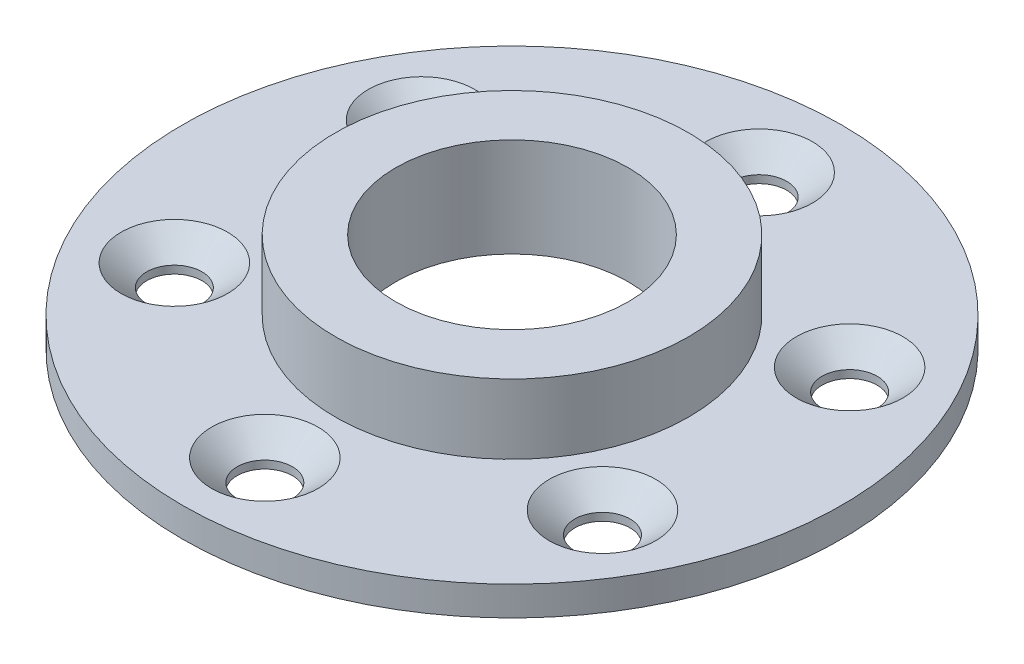
ISO-10303-21;
HEADER;
FILE_DESCRIPTION(('STEP AP214'),'2;1');
FILE_NAME('part.step','',(''),(''),'','','');
FILE_SCHEMA(('AUTOMOTIVE_DESIGN { 1 0 10303 214 1 1 1 1 }'));
ENDSEC;
DATA;
#1=APPLICATION_CONTEXT('core data for automotive mechanical design processes');
#2=APPLICATION_PROTOCOL_DEFINITION('international standard','automotive_design',2000,#1);
#3=PRODUCT_CONTEXT('',#1,'mechanical');
#4=PRODUCT('Part','Part','',(#3));
#5=PRODUCT_RELATED_PRODUCT_CATEGORY('part','',(#4));
#6=PRODUCT_DEFINITION_FORMATION('','',#4);
#7=PRODUCT_DEFINITION_CONTEXT('part definition',#1,'design');
#8=PRODUCT_DEFINITION('design','',#6,#7);
#9=PRODUCT_DEFINITION_SHAPE('','',#8);
#10=(LENGTH_UNIT() NAMED_UNIT(*) SI_UNIT(.MILLI.,.METRE.));
#11=(NAMED_UNIT(*) PLANE_ANGLE_UNIT() SI_UNIT($,.RADIAN.));
#12=(NAMED_UNIT(*) SI_UNIT($,.STERADIAN.) SOLID_ANGLE_UNIT());
#13=UNCERTAINTY_MEASURE_WITH_UNIT(LENGTH_MEASURE(1.E-05),#10,'distance_accuracy_value','');
#14=(GEOMETRIC_REPRESENTATION_CONTEXT(3) GLOBAL_UNCERTAINTY_ASSIGNED_CONTEXT((#13)) GLOBAL_UNIT_ASSIGNED_CONTEXT((#10,
#11,#12)) REPRESENTATION_CONTEXT('',''));
#15=CARTESIAN_POINT('',(0.,0.,0.));
#16=DIRECTION('',(0.,0.,1.));
#17=DIRECTION('',(1.,0.,0.));
#18=AXIS2_PLACEMENT_3D('',#15,#16,#17);
#19=CARTESIAN_POINT('',(0.,8.,0.));
#20=DIRECTION('',(0.,-1.,0.));
#21=DIRECTION('',(0.,0.,-1.));
#22=AXIS2_PLACEMENT_3D('',#19,#20,#21);
#23=CYLINDRICAL_SURFACE('',#22,90.);
#24=CARTESIAN_POINT('',(0.,8.,0.));
#25=DIRECTION('',(0.,1.,0.));
#26=DIRECTION('',(0.,0.,1.));
#27=AXIS2_PLACEMENT_3D('',#24,#25,#26);
#28=CIRCLE('',#27,90.);
#29=CARTESIAN_POINT('',(0.,8.,90.));
#30=VERTEX_POINT('',#29);
#31=EDGE_CURVE('E12',#30,#30,#28,.T.);
#32=ORIENTED_EDGE('',*,*,#31,.F.);
#33=EDGE_LOOP('',(#32));
#34=FACE_BOUND('',#33,.T.);
#35=CARTESIAN_POINT('',(0.,0.,0.));
#36=DIRECTION('',(0.,1.,0.));
#37=DIRECTION('',(0.,0.,1.));
#38=AXIS2_PLACEMENT_3D('',#35,#36,#37);
#39=CIRCLE('',#38,90.);
#40=CARTESIAN_POINT('',(0.,0.,90.));
#41=VERTEX_POINT('',#40);
#42=EDGE_CURVE('E65',#41,#41,#39,.T.);
#43=ORIENTED_EDGE('',*,*,#42,.T.);
#44=EDGE_LOOP('',(#43));
#45=FACE_BOUND('',#44,.T.);
#46=ADVANCED_FACE('F62',(#34,#45),#23,.T.);
#47=CARTESIAN_POINT('',(0.,8.,0.));
#48=DIRECTION('',(0.,1.,0.));
#49=DIRECTION('',(0.,0.,1.));
#50=AXIS2_PLACEMENT_3D('',#47,#48,#49);
#51=PLANE('',#50);
#52=CARTESIAN_POINT('',(58.4567147554492,8.,-33.7500000000007));
#53=DIRECTION('',(0.,1.,0.));
#54=DIRECTION('',(0.,0.,1.));
#55=AXIS2_PLACEMENT_3D('',#52,#53,#54);
#56=CIRCLE('',#55,14.5415);
#57=CARTESIAN_POINT('',(58.4567147554492,8.,-19.2085000000007));
#58=VERTEX_POINT('',#57);
#59=EDGE_CURVE('E159',#58,#58,#56,.T.);
#60=ORIENTED_EDGE('',*,*,#59,.F.);
#61=EDGE_LOOP('',(#60));
#62=FACE_BOUND('',#61,.T.);
#63=CARTESIAN_POINT('',(58.4567147554499,8.,33.7499999999995));
#64=DIRECTION('',(0.,1.,0.));
#65=DIRECTION('',(0.,0.,1.));
#66=AXIS2_PLACEMENT_3D('',#63,#64,#65);
#67=CIRCLE('',#66,14.5415);
#68=CARTESIAN_POINT('',(58.4567147554499,8.,48.2914999999995));
#69=VERTEX_POINT('',#68);
#70=EDGE_CURVE('E147',#69,#69,#67,.T.);
#71=ORIENTED_EDGE('',*,*,#70,.F.);
#72=EDGE_LOOP('',(#71));
#73=FACE_BOUND('',#72,.T.);
#74=CARTESIAN_POINT('',(0.,8.,67.5));
#75=DIRECTION('',(0.,1.,0.));
#76=DIRECTION('',(0.,0.,1.));
#77=AXIS2_PLACEMENT_3D('',#74,#75,#76);
#78=CIRCLE('',#77,14.5415);
#79=CARTESIAN_POINT('',(0.,8.,82.0415));
#80=VERTEX_POINT('',#79);
#81=EDGE_CURVE('E135',#80,#80,#78,.T.);
#82=ORIENTED_EDGE('',*,*,#81,.F.);
#83=EDGE_LOOP('',(#82));
#84=FACE_BOUND('',#83,.T.);
#85=CARTESIAN_POINT('',(-58.4567147554495,8.,33.7500000000003));
#86=DIRECTION('',(0.,1.,0.));
#87=DIRECTION('',(0.,0.,1.));
#88=AXIS2_PLACEMENT_3D('',#85,#86,#87);
#89=CIRCLE('',#88,14.5415);
#90=CARTESIAN_POINT('',(-58.4567147554495,8.,48.2915000000003));
#91=VERTEX_POINT('',#90);
#92=EDGE_CURVE('E123',#91,#91,#89,.T.);
#93=ORIENTED_EDGE('',*,*,#92,.F.);
#94=EDGE_LOOP('',(#93));
#95=FACE_BOUND('',#94,.T.);
#96=CARTESIAN_POINT('',(-58.4567147554497,8.,-33.7499999999999));
#97=DIRECTION('',(0.,1.,0.));
#98=DIRECTION('',(0.,0.,1.));
#99=AXIS2_PLACEMENT_3D('',#96,#97,#98);
#100=CIRCLE('',#99,14.5415);
#101=CARTESIAN_POINT('',(-58.4567147554497,8.,-19.2084999999999));
#102=VERTEX_POINT('',#101);
#103=EDGE_CURVE('E111',#102,#102,#100,.T.);
#104=ORIENTED_EDGE('',*,*,#103,.F.);
#105=EDGE_LOOP('',(#104));
#106=FACE_BOUND('',#105,.T.);
#107=CARTESIAN_POINT('',(0.,8.,-67.5));
#108=DIRECTION('',(0.,1.,0.));
#109=DIRECTION('',(0.,0.,1.));
#110=AXIS2_PLACEMENT_3D('',#107,#108,#109);
#111=CIRCLE('',#110,14.5415);
#112=CARTESIAN_POINT('',(0.,8.,-52.9585));
#113=VERTEX_POINT('',#112);
#114=EDGE_CURVE('E99',#113,#113,#111,.T.);
#115=ORIENTED_EDGE('',*,*,#114,.F.);
#116=EDGE_LOOP('',(#115));
#117=FACE_BOUND('',#116,.T.);
#118=CARTESIAN_POINT('',(0.,8.,0.));
#119=DIRECTION('',(0.,1.,0.));
#120=DIRECTION('',(1.,0.,0.));
#121=AXIS2_PLACEMENT_3D('',#118,#119,#120);
#122=CIRCLE('',#121,48.25);
#123=CARTESIAN_POINT('',(48.25,8.,0.));
#124=VERTEX_POINT('',#123);
#125=EDGE_CURVE('E77',#124,#124,#122,.T.);
#126=ORIENTED_EDGE('',*,*,#125,.F.);
#127=EDGE_LOOP('',(#126));
#128=FACE_BOUND('',#127,.T.);
#129=ORIENTED_EDGE('',*,*,#31,.T.);
#130=EDGE_LOOP('',(#129));
#131=FACE_BOUND('',#130,.T.);
#132=ADVANCED_FACE('F190',(#62,#73,#84,#95,#106,#117,#128,#131),#51,.T.);
#133=CARTESIAN_POINT('',(0.,0.,0.));
#134=DIRECTION('',(0.,1.,0.));
#135=DIRECTION('',(0.,0.,1.));
#136=AXIS2_PLACEMENT_3D('',#133,#134,#135);
#137=PLANE('',#136);
#138=CARTESIAN_POINT('',(0.,0.,0.));
#139=DIRECTION('',(0.,1.,0.));
#140=DIRECTION('',(0.,0.,1.));
#141=AXIS2_PLACEMENT_3D('',#138,#139,#140);
#142=CIRCLE('',#141,31.75);
#143=CARTESIAN_POINT('',(0.,0.,31.75));
#144=VERTEX_POINT('',#143);
#145=EDGE_CURVE('E163',#144,#144,#142,.T.);
#146=ORIENTED_EDGE('',*,*,#145,.T.);
#147=EDGE_LOOP('',(#146));
#148=FACE_BOUND('',#147,.T.);
#149=CARTESIAN_POINT('',(58.4567147554492,0.,-33.7500000000007));
#150=DIRECTION('',(0.,1.,0.));
#151=DIRECTION('',(0.,0.,1.));
#152=AXIS2_PLACEMENT_3D('',#149,#150,#151);
#153=CIRCLE('',#152,7.53999);
#154=CARTESIAN_POINT('',(58.4567147554492,0.,-26.2100100000007));
#155=VERTEX_POINT('',#154);
#156=EDGE_CURVE('E151',#155,#155,#153,.T.);
#157=ORIENTED_EDGE('',*,*,#156,.T.);
#158=EDGE_LOOP('',(#157));
#159=FACE_BOUND('',#158,.T.);
#160=CARTESIAN_POINT('',(58.4567147554499,0.,33.7499999999995));
#161=DIRECTION('',(0.,1.,0.));
#162=DIRECTION('',(0.,0.,1.));
#163=AXIS2_PLACEMENT_3D('',#160,#161,#162);
#164=CIRCLE('',#163,7.53999);
#165=CARTESIAN_POINT('',(58.4567147554499,0.,41.2899899999995));
#166=VERTEX_POINT('',#165);
#167=EDGE_CURVE('E139',#166,#166,#164,.T.);
#168=ORIENTED_EDGE('',*,*,#167,.T.);
#169=EDGE_LOOP('',(#168));
#170=FACE_BOUND('',#169,.T.);
#171=CARTESIAN_POINT('',(0.,0.,67.5));
#172=DIRECTION('',(0.,1.,0.));
#173=DIRECTION('',(0.,0.,1.));
#174=AXIS2_PLACEMENT_3D('',#171,#172,#173);
#175=CIRCLE('',#174,7.53999);
#176=CARTESIAN_POINT('',(0.,0.,75.03999));
#177=VERTEX_POINT('',#176);
#178=EDGE_CURVE('E127',#177,#177,#175,.T.);
#179=ORIENTED_EDGE('',*,*,#178,.T.);
#180=EDGE_LOOP('',(#179));
#181=FACE_BOUND('',#180,.T.);
#182=CARTESIAN_POINT('',(-58.4567147554495,0.,33.7500000000003));
#183=DIRECTION('',(0.,1.,0.));
#184=DIRECTION('',(0.,0.,1.));
#185=AXIS2_PLACEMENT_3D('',#182,#183,#184);
#186=CIRCLE('',#185,7.53999);
#187=CARTESIAN_POINT('',(-58.4567147554495,0.,41.2899900000003));
#188=VERTEX_POINT('',#187);
#189=EDGE_CURVE('E115',#188,#188,#186,.T.);
#190=ORIENTED_EDGE('',*,*,#189,.T.);
#191=EDGE_LOOP('',(#190));
#192=FACE_BOUND('',#191,.T.);
#193=CARTESIAN_POINT('',(-58.4567147554497,0.,-33.7499999999999));
#194=DIRECTION('',(0.,1.,0.));
#195=DIRECTION('',(0.,0.,1.));
#196=AXIS2_PLACEMENT_3D('',#193,#194,#195);
#197=CIRCLE('',#196,7.53999);
#198=CARTESIAN_POINT('',(-58.4567147554497,0.,-26.2100099999999));
#199=VERTEX_POINT('',#198);
#200=EDGE_CURVE('E103',#199,#199,#197,.T.);
#201=ORIENTED_EDGE('',*,*,#200,.T.);
#202=EDGE_LOOP('',(#201));
#203=FACE_BOUND('',#202,.T.);
#204=CARTESIAN_POINT('',(0.,0.,-67.5));
#205=DIRECTION('',(0.,1.,0.));
#206=DIRECTION('',(0.,0.,1.));
#207=AXIS2_PLACEMENT_3D('',#204,#205,#206);
#208=CIRCLE('',#207,7.53999);
#209=CARTESIAN_POINT('',(0.,0.,-59.96001));
#210=VERTEX_POINT('',#209);
#211=EDGE_CURVE('E91',#210,#210,#208,.T.);
#212=ORIENTED_EDGE('',*,*,#211,.T.);
#213=EDGE_LOOP('',(#212));
#214=FACE_BOUND('',#213,.T.);
#215=ORIENTED_EDGE('',*,*,#42,.F.);
#216=EDGE_LOOP('',(#215));
#217=FACE_BOUND('',#216,.T.);
#218=ADVANCED_FACE('F168',(#148,#159,#170,#181,#192,#203,#214,#217),#137,.F.);
#219=CARTESIAN_POINT('',(0.,27.,0.));
#220=DIRECTION('',(0.,1.,0.));
#221=DIRECTION('',(0.,0.,1.));
#222=AXIS2_PLACEMENT_3D('',#219,#220,#221);
#223=PLANE('',#222);
#224=CARTESIAN_POINT('',(0.,27.,0.));
#225=DIRECTION('',(0.,1.,0.));
#226=DIRECTION('',(1.,0.,0.));
#227=AXIS2_PLACEMENT_3D('',#224,#225,#226);
#228=CIRCLE('',#227,48.25);
#229=CARTESIAN_POINT('',(48.25,27.,0.));
#230=VERTEX_POINT('',#229);
#231=EDGE_CURVE('E76',#230,#230,#228,.T.);
#232=ORIENTED_EDGE('',*,*,#231,.T.);
#233=EDGE_LOOP('',(#232));
#234=FACE_BOUND('',#233,.T.);
#235=CARTESIAN_POINT('',(0.,27.,0.));
#236=DIRECTION('',(0.,1.,0.));
#237=DIRECTION('',(1.,0.,0.));
#238=AXIS2_PLACEMENT_3D('',#235,#236,#237);
#239=CIRCLE('',#238,31.75);
#240=CARTESIAN_POINT('',(31.75,27.,0.));
#241=VERTEX_POINT('',#240);
#242=EDGE_CURVE('E82',#241,#241,#239,.T.);
#243=ORIENTED_EDGE('',*,*,#242,.F.);
#244=EDGE_LOOP('',(#243));
#245=FACE_BOUND('',#244,.T.);
#246=ADVANCED_FACE('F185',(#234,#245),#223,.T.);
#247=CARTESIAN_POINT('',(0.,27.,0.));
#248=DIRECTION('',(0.,-1.,0.));
#249=DIRECTION('',(0.,0.,-1.));
#250=AXIS2_PLACEMENT_3D('',#247,#248,#249);
#251=CYLINDRICAL_SURFACE('',#250,48.25);
#252=ORIENTED_EDGE('',*,*,#231,.F.);
#253=EDGE_LOOP('',(#252));
#254=FACE_BOUND('',#253,.T.);
#255=ORIENTED_EDGE('',*,*,#125,.T.);
#256=EDGE_LOOP('',(#255));
#257=FACE_BOUND('',#256,.T.);
#258=ADVANCED_FACE('F174',(#254,#257),#251,.T.);
#259=CARTESIAN_POINT('',(0.,27.,0.));
#260=DIRECTION('',(0.,-1.,0.));
#261=DIRECTION('',(0.,0.,-1.));
#262=AXIS2_PLACEMENT_3D('',#259,#260,#261);
#263=CYLINDRICAL_SURFACE('',#262,31.75);
#264=ORIENTED_EDGE('',*,*,#242,.T.);
#265=EDGE_LOOP('',(#264));
#266=FACE_BOUND('',#265,.T.);
#267=ORIENTED_EDGE('',*,*,#145,.F.);
#268=EDGE_LOOP('',(#267));
#269=FACE_BOUND('',#268,.T.);
#270=ADVANCED_FACE('F171',(#266,#269),#263,.F.);
#271=CARTESIAN_POINT('',(0.,8.,-67.5));
#272=DIRECTION('',(0.,1.,0.));
#273=DIRECTION('',(0.,0.,1.));
#274=AXIS2_PLACEMENT_3D('',#271,#272,#273);
#275=CYLINDRICAL_SURFACE('',#274,7.53999);
#276=ORIENTED_EDGE('',*,*,#211,.F.);
#277=EDGE_LOOP('',(#276));
#278=FACE_BOUND('',#277,.T.);
#279=CARTESIAN_POINT('',(0.,2.12503554131596,-67.5));
#280=DIRECTION('',(0.,1.,0.));
#281=DIRECTION('',(0.,0.,1.));
#282=AXIS2_PLACEMENT_3D('',#279,#280,#281);
#283=CIRCLE('',#282,7.53999);
#284=CARTESIAN_POINT('',(0.,2.12503554131596,-59.96001));
#285=VERTEX_POINT('',#284);
#286=EDGE_CURVE('E95',#285,#285,#283,.T.);
#287=ORIENTED_EDGE('',*,*,#286,.T.);
#288=EDGE_LOOP('',(#287));
#289=FACE_BOUND('',#288,.T.);
#290=ADVANCED_FACE('F173',(#278,#289),#275,.F.);
#291=CARTESIAN_POINT('',(0.,8.,-67.5));
#292=DIRECTION('',(0.,1.,0.));
#293=DIRECTION('',(0.,0.,1.));
#294=AXIS2_PLACEMENT_3D('',#291,#292,#293);
#295=CONICAL_SURFACE('',#294,14.5415,0.872664625997165);
#296=ORIENTED_EDGE('',*,*,#286,.F.);
#297=EDGE_LOOP('',(#296));
#298=FACE_BOUND('',#297,.T.);
#299=ORIENTED_EDGE('',*,*,#114,.T.);
#300=EDGE_LOOP('',(#299));
#301=FACE_BOUND('',#300,.T.);
#302=ADVANCED_FACE('F181',(#298,#301),#295,.F.);
#303=CARTESIAN_POINT('',(-58.4567147554497,8.,-33.7499999999999));
#304=DIRECTION('',(0.,1.,0.));
#305=DIRECTION('',(0.,0.,1.));
#306=AXIS2_PLACEMENT_3D('',#303,#304,#305);
#307=CYLINDRICAL_SURFACE('',#306,7.53999);
#308=ORIENTED_EDGE('',*,*,#200,.F.);
#309=EDGE_LOOP('',(#308));
#310=FACE_BOUND('',#309,.T.);
#311=CARTESIAN_POINT('',(-58.4567147554497,2.12503554131596,-33.7499999999999));
#312=DIRECTION('',(0.,1.,0.));
#313=DIRECTION('',(0.,0.,1.));
#314=AXIS2_PLACEMENT_3D('',#311,#312,#313);
#315=CIRCLE('',#314,7.53999);
#316=CARTESIAN_POINT('',(-58.4567147554497,2.12503554131596,-26.2100099999999));
#317=VERTEX_POINT('',#316);
#318=EDGE_CURVE('E107',#317,#317,#315,.T.);
#319=ORIENTED_EDGE('',*,*,#318,.T.);
#320=EDGE_LOOP('',(#319));
#321=FACE_BOUND('',#320,.T.);
#322=ADVANCED_FACE('F229',(#310,#321),#307,.F.);
#323=CARTESIAN_POINT('',(-58.4567147554497,8.,-33.7499999999999));
#324=DIRECTION('',(0.,1.,0.));
#325=DIRECTION('',(0.,0.,1.));
#326=AXIS2_PLACEMENT_3D('',#323,#324,#325);
#327=CONICAL_SURFACE('',#326,14.5415,0.872664625997165);
#328=ORIENTED_EDGE('',*,*,#318,.F.);
#329=EDGE_LOOP('',(#328));
#330=FACE_BOUND('',#329,.T.);
#331=ORIENTED_EDGE('',*,*,#103,.T.);
#332=EDGE_LOOP('',(#331));
#333=FACE_BOUND('',#332,.T.);
#334=ADVANCED_FACE('F246',(#330,#333),#327,.F.);
#335=CARTESIAN_POINT('',(-58.4567147554495,8.,33.7500000000003));
#336=DIRECTION('',(0.,1.,0.));
#337=DIRECTION('',(0.,0.,1.));
#338=AXIS2_PLACEMENT_3D('',#335,#336,#337);
#339=CYLINDRICAL_SURFACE('',#338,7.53999);
#340=ORIENTED_EDGE('',*,*,#189,.F.);
#341=EDGE_LOOP('',(#340));
#342=FACE_BOUND('',#341,.T.);
#343=CARTESIAN_POINT('',(-58.4567147554495,2.12503554131596,33.7500000000003));
#344=DIRECTION('',(0.,1.,0.));
#345=DIRECTION('',(0.,0.,1.));
#346=AXIS2_PLACEMENT_3D('',#343,#344,#345);
#347=CIRCLE('',#346,7.53999);
#348=CARTESIAN_POINT('',(-58.4567147554495,2.12503554131596,41.2899900000003));
#349=VERTEX_POINT('',#348);
#350=EDGE_CURVE('E119',#349,#349,#347,.T.);
#351=ORIENTED_EDGE('',*,*,#350,.T.);
#352=EDGE_LOOP('',(#351));
#353=FACE_BOUND('',#352,.T.);
#354=ADVANCED_FACE('F260',(#342,#353),#339,.F.);
#355=CARTESIAN_POINT('',(-58.4567147554495,8.,33.7500000000003));
#356=DIRECTION('',(0.,1.,0.));
#357=DIRECTION('',(0.,0.,1.));
#358=AXIS2_PLACEMENT_3D('',#355,#356,#357);
#359=CONICAL_SURFACE('',#358,14.5415,0.872664625997165);
#360=ORIENTED_EDGE('',*,*,#350,.F.);
#361=EDGE_LOOP('',(#360));
#362=FACE_BOUND('',#361,.T.);
#363=ORIENTED_EDGE('',*,*,#92,.T.);
#364=EDGE_LOOP('',(#363));
#365=FACE_BOUND('',#364,.T.);
#366=ADVANCED_FACE('F274',(#362,#365),#359,.F.);
#367=CARTESIAN_POINT('',(0.,8.,67.5));
#368=DIRECTION('',(0.,1.,0.));
#369=DIRECTION('',(0.,0.,1.));
#370=AXIS2_PLACEMENT_3D('',#367,#368,#369);
#371=CYLINDRICAL_SURFACE('',#370,7.53999);
#372=ORIENTED_EDGE('',*,*,#178,.F.);
#373=EDGE_LOOP('',(#372));
#374=FACE_BOUND('',#373,.T.);
#375=CARTESIAN_POINT('',(0.,2.12503554131596,67.5));
#376=DIRECTION('',(0.,1.,0.));
#377=DIRECTION('',(0.,0.,1.));
#378=AXIS2_PLACEMENT_3D('',#375,#376,#377);
#379=CIRCLE('',#378,7.53999);
#380=CARTESIAN_POINT('',(0.,2.12503554131596,75.03999));
#381=VERTEX_POINT('',#380);
#382=EDGE_CURVE('E131',#381,#381,#379,.T.);
#383=ORIENTED_EDGE('',*,*,#382,.T.);
#384=EDGE_LOOP('',(#383));
#385=FACE_BOUND('',#384,.T.);
#386=ADVANCED_FACE('F287',(#374,#385),#371,.F.);
#387=CARTESIAN_POINT('',(0.,8.,67.5));
#388=DIRECTION('',(0.,1.,0.));
#389=DIRECTION('',(0.,0.,1.));
#390=AXIS2_PLACEMENT_3D('',#387,#388,#389);
#391=CONICAL_SURFACE('',#390,14.5415,0.872664625997165);
#392=ORIENTED_EDGE('',*,*,#382,.F.);
#393=EDGE_LOOP('',(#392));
#394=FACE_BOUND('',#393,.T.);
#395=ORIENTED_EDGE('',*,*,#81,.T.);
#396=EDGE_LOOP('',(#395));
#397=FACE_BOUND('',#396,.T.);
#398=ADVANCED_FACE('F300',(#394,#397),#391,.F.);
#399=CARTESIAN_POINT('',(58.4567147554499,8.,33.7499999999995));
#400=DIRECTION('',(0.,1.,0.));
#401=DIRECTION('',(0.,0.,1.));
#402=AXIS2_PLACEMENT_3D('',#399,#400,#401);
#403=CYLINDRICAL_SURFACE('',#402,7.53999);
#404=ORIENTED_EDGE('',*,*,#167,.F.);
#405=EDGE_LOOP('',(#404));
#406=FACE_BOUND('',#405,.T.);
#407=CARTESIAN_POINT('',(58.4567147554499,2.12503554131596,33.7499999999995));
#408=DIRECTION('',(0.,1.,0.));
#409=DIRECTION('',(0.,0.,1.));
#410=AXIS2_PLACEMENT_3D('',#407,#408,#409);
#411=CIRCLE('',#410,7.53999);
#412=CARTESIAN_POINT('',(58.4567147554499,2.12503554131596,41.2899899999995));
#413=VERTEX_POINT('',#412);
#414=EDGE_CURVE('E143',#413,#413,#411,.T.);
#415=ORIENTED_EDGE('',*,*,#414,.T.);
#416=EDGE_LOOP('',(#415));
#417=FACE_BOUND('',#416,.T.);
#418=ADVANCED_FACE('F313',(#406,#417),#403,.F.);
#419=CARTESIAN_POINT('',(58.4567147554499,8.,33.7499999999995));
#420=DIRECTION('',(0.,1.,0.));
#421=DIRECTION('',(0.,0.,1.));
#422=AXIS2_PLACEMENT_3D('',#419,#420,#421);
#423=CONICAL_SURFACE('',#422,14.5415,0.872664625997165);
#424=ORIENTED_EDGE('',*,*,#414,.F.);
#425=EDGE_LOOP('',(#424));
#426=FACE_BOUND('',#425,.T.);
#427=ORIENTED_EDGE('',*,*,#70,.T.);
#428=EDGE_LOOP('',(#427));
#429=FACE_BOUND('',#428,.T.);
#430=ADVANCED_FACE('F326',(#426,#429),#423,.F.);
#431=CARTESIAN_POINT('',(58.4567147554492,8.,-33.7500000000007));
#432=DIRECTION('',(0.,1.,0.));
#433=DIRECTION('',(0.,0.,1.));
#434=AXIS2_PLACEMENT_3D('',#431,#432,#433);
#435=CYLINDRICAL_SURFACE('',#434,7.53999);
#436=ORIENTED_EDGE('',*,*,#156,.F.);
#437=EDGE_LOOP('',(#436));
#438=FACE_BOUND('',#437,.T.);
#439=CARTESIAN_POINT('',(58.4567147554492,2.12503554131596,-33.7500000000007));
#440=DIRECTION('',(0.,1.,0.));
#441=DIRECTION('',(0.,0.,1.));
#442=AXIS2_PLACEMENT_3D('',#439,#440,#441);
#443=CIRCLE('',#442,7.53999);
#444=CARTESIAN_POINT('',(58.4567147554492,2.12503554131596,-26.2100100000007));
#445=VERTEX_POINT('',#444);
#446=EDGE_CURVE('E155',#445,#445,#443,.T.);
#447=ORIENTED_EDGE('',*,*,#446,.T.);
#448=EDGE_LOOP('',(#447));
#449=FACE_BOUND('',#448,.T.);
#450=ADVANCED_FACE('F338',(#438,#449),#435,.F.);
#451=CARTESIAN_POINT('',(58.4567147554492,8.,-33.7500000000007));
#452=DIRECTION('',(0.,1.,0.));
#453=DIRECTION('',(0.,0.,1.));
#454=AXIS2_PLACEMENT_3D('',#451,#452,#453);
#455=CONICAL_SURFACE('',#454,14.5415,0.872664625997164);
#456=ORIENTED_EDGE('',*,*,#446,.F.);
#457=EDGE_LOOP('',(#456));
#458=FACE_BOUND('',#457,.T.);
#459=ORIENTED_EDGE('',*,*,#59,.T.);
#460=EDGE_LOOP('',(#459));
#461=FACE_BOUND('',#460,.T.);
#462=ADVANCED_FACE('F351',(#458,#461),#455,.F.);
#463=CLOSED_SHELL('',(#46,#132,#218,#246,#258,#270,#290,#302,#322,#334,#354,#366,#386,#398,#418,
#430,#450,#462));
#464=MANIFOLD_SOLID_BREP('B2',#463);
#465=ADVANCED_BREP_SHAPE_REPRESENTATION('',(#18,#464),#14);
#466=SHAPE_DEFINITION_REPRESENTATION(#9,#465);
ENDSEC;
END-ISO-10303-21;
